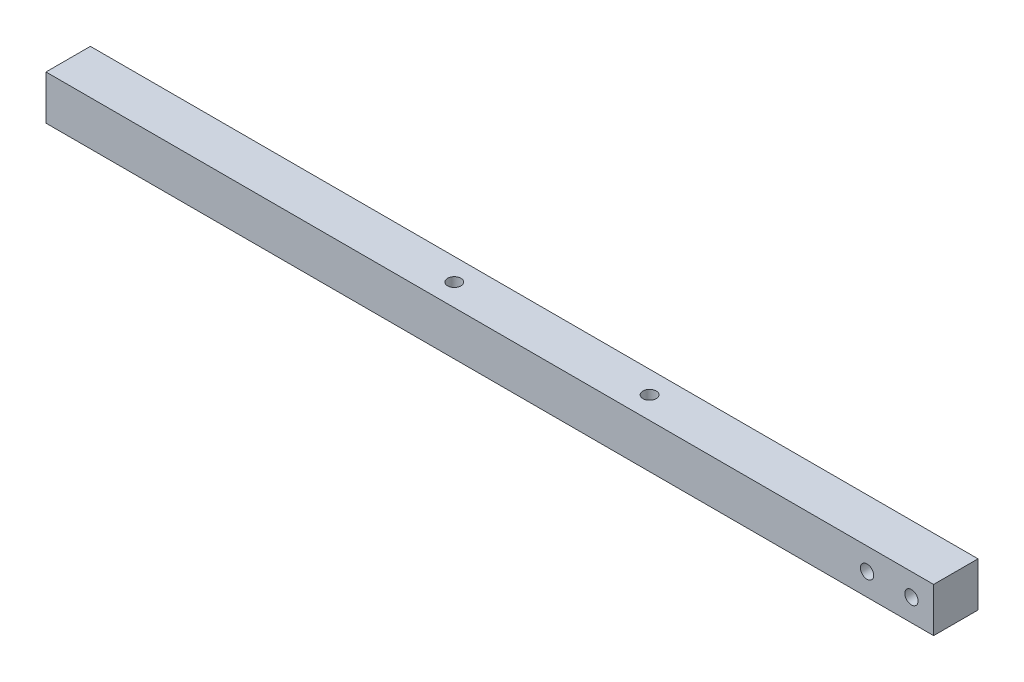
ISO-10303-21;
HEADER;
FILE_DESCRIPTION(('STEP AP214'),'2;1');
FILE_NAME('part.step','',(''),(''),'','','');
FILE_SCHEMA(('AUTOMOTIVE_DESIGN { 1 0 10303 214 1 1 1 1 }'));
ENDSEC;
DATA;
#1=APPLICATION_CONTEXT('core data for automotive mechanical design processes');
#2=APPLICATION_PROTOCOL_DEFINITION('international standard','automotive_design',2000,#1);
#3=PRODUCT_CONTEXT('',#1,'mechanical');
#4=PRODUCT('Part','Part','',(#3));
#5=PRODUCT_RELATED_PRODUCT_CATEGORY('part','',(#4));
#6=PRODUCT_DEFINITION_FORMATION('','',#4);
#7=PRODUCT_DEFINITION_CONTEXT('part definition',#1,'design');
#8=PRODUCT_DEFINITION('design','',#6,#7);
#9=PRODUCT_DEFINITION_SHAPE('','',#8);
#10=(LENGTH_UNIT() NAMED_UNIT(*) SI_UNIT(.MILLI.,.METRE.));
#11=(NAMED_UNIT(*) PLANE_ANGLE_UNIT() SI_UNIT($,.RADIAN.));
#12=(NAMED_UNIT(*) SI_UNIT($,.STERADIAN.) SOLID_ANGLE_UNIT());
#13=UNCERTAINTY_MEASURE_WITH_UNIT(LENGTH_MEASURE(1.E-05),#10,'distance_accuracy_value','');
#14=(GEOMETRIC_REPRESENTATION_CONTEXT(3) GLOBAL_UNCERTAINTY_ASSIGNED_CONTEXT((#13)) GLOBAL_UNIT_ASSIGNED_CONTEXT((#10,
#11,#12)) REPRESENTATION_CONTEXT('',''));
#15=CARTESIAN_POINT('',(0.,0.,0.));
#16=DIRECTION('',(0.,0.,1.));
#17=DIRECTION('',(1.,0.,0.));
#18=AXIS2_PLACEMENT_3D('',#15,#16,#17);
#19=CARTESIAN_POINT('',(400.,-10.,-10.));
#20=DIRECTION('',(0.,0.,1.));
#21=DIRECTION('',(1.,0.,0.));
#22=AXIS2_PLACEMENT_3D('',#19,#20,#21);
#23=PLANE('',#22);
#24=CARTESIAN_POINT('',(390.,0.,-10.));
#25=DIRECTION('',(0.,0.,1.));
#26=DIRECTION('',(1.,0.,0.));
#27=AXIS2_PLACEMENT_3D('',#24,#25,#26);
#28=CIRCLE('',#27,2.99999999999999);
#29=CARTESIAN_POINT('',(393.,0.,-10.));
#30=VERTEX_POINT('',#29);
#31=EDGE_CURVE('E114',#30,#30,#28,.T.);
#32=ORIENTED_EDGE('',*,*,#31,.T.);
#33=EDGE_LOOP('',(#32));
#34=FACE_BOUND('',#33,.T.);
#35=CARTESIAN_POINT('',(370.,0.,-10.));
#36=DIRECTION('',(0.,0.,1.));
#37=DIRECTION('',(1.,0.,0.));
#38=AXIS2_PLACEMENT_3D('',#35,#36,#37);
#39=CIRCLE('',#38,2.99999999999999);
#40=CARTESIAN_POINT('',(373.,0.,-10.));
#41=VERTEX_POINT('',#40);
#42=EDGE_CURVE('E125',#41,#41,#39,.T.);
#43=ORIENTED_EDGE('',*,*,#42,.T.);
#44=EDGE_LOOP('',(#43));
#45=FACE_BOUND('',#44,.T.);
#46=DIRECTION('',(0.,1.,0.));
#47=VECTOR('',#46,1.);
#48=CARTESIAN_POINT('',(0.,-10.,-10.));
#49=LINE('',#48,#47);
#50=CARTESIAN_POINT('',(0.,-10.,-10.));
#51=VERTEX_POINT('',#50);
#52=CARTESIAN_POINT('',(0.,10.,-10.));
#53=VERTEX_POINT('',#52);
#54=EDGE_CURVE('E96',#51,#53,#49,.T.);
#55=ORIENTED_EDGE('',*,*,#54,.T.);
#56=DIRECTION('',(-1.,0.,0.));
#57=VECTOR('',#56,1.);
#58=CARTESIAN_POINT('',(400.,10.,-10.));
#59=LINE('',#58,#57);
#60=CARTESIAN_POINT('',(400.,10.,-10.));
#61=VERTEX_POINT('',#60);
#62=EDGE_CURVE('E11',#61,#53,#59,.T.);
#63=ORIENTED_EDGE('',*,*,#62,.F.);
#64=DIRECTION('',(0.,1.,0.));
#65=VECTOR('',#64,1.);
#66=CARTESIAN_POINT('',(400.,-10.,-10.));
#67=LINE('',#66,#65);
#68=CARTESIAN_POINT('',(400.,-10.,-10.));
#69=VERTEX_POINT('',#68);
#70=EDGE_CURVE('E84',#69,#61,#67,.T.);
#71=ORIENTED_EDGE('',*,*,#70,.F.);
#72=DIRECTION('',(-1.,0.,0.));
#73=VECTOR('',#72,1.);
#74=CARTESIAN_POINT('',(400.,-10.,-10.));
#75=LINE('',#74,#73);
#76=EDGE_CURVE('E92',#69,#51,#75,.T.);
#77=ORIENTED_EDGE('',*,*,#76,.T.);
#78=EDGE_LOOP('',(#55,#63,#71,#77));
#79=FACE_BOUND('',#78,.T.);
#80=ADVANCED_FACE('F33',(#34,#45,#79),#23,.F.);
#81=CARTESIAN_POINT('',(400.,10.,10.));
#82=DIRECTION('',(0.,-1.,0.));
#83=DIRECTION('',(0.,0.,-1.));
#84=AXIS2_PLACEMENT_3D('',#81,#82,#83);
#85=PLANE('',#84);
#86=CARTESIAN_POINT('',(174.,10.,0.));
#87=DIRECTION('',(0.,1.,0.));
#88=DIRECTION('',(0.,0.,1.));
#89=AXIS2_PLACEMENT_3D('',#86,#87,#88);
#90=CIRCLE('',#89,2.99999999999999);
#91=CARTESIAN_POINT('',(174.,10.,2.99999999999999));
#92=VERTEX_POINT('',#91);
#93=EDGE_CURVE('E117',#92,#92,#90,.T.);
#94=ORIENTED_EDGE('',*,*,#93,.F.);
#95=EDGE_LOOP('',(#94));
#96=FACE_BOUND('',#95,.T.);
#97=CARTESIAN_POINT('',(262.,10.,0.));
#98=DIRECTION('',(0.,1.,0.));
#99=DIRECTION('',(0.,0.,1.));
#100=AXIS2_PLACEMENT_3D('',#97,#98,#99);
#101=CIRCLE('',#100,2.99999999999999);
#102=CARTESIAN_POINT('',(262.,10.,2.99999999999999));
#103=VERTEX_POINT('',#102);
#104=EDGE_CURVE('E110',#103,#103,#101,.T.);
#105=ORIENTED_EDGE('',*,*,#104,.F.);
#106=EDGE_LOOP('',(#105));
#107=FACE_BOUND('',#106,.T.);
#108=DIRECTION('',(0.,0.,1.));
#109=VECTOR('',#108,1.);
#110=CARTESIAN_POINT('',(0.,10.,10.));
#111=LINE('',#110,#109);
#112=CARTESIAN_POINT('',(0.,10.,10.));
#113=VERTEX_POINT('',#112);
#114=EDGE_CURVE('E88',#53,#113,#111,.T.);
#115=ORIENTED_EDGE('',*,*,#114,.T.);
#116=DIRECTION('',(-1.,0.,0.));
#117=VECTOR('',#116,1.);
#118=CARTESIAN_POINT('',(400.,10.,10.));
#119=LINE('',#118,#117);
#120=CARTESIAN_POINT('',(400.,10.,10.));
#121=VERTEX_POINT('',#120);
#122=EDGE_CURVE('E41',#121,#113,#119,.T.);
#123=ORIENTED_EDGE('',*,*,#122,.F.);
#124=DIRECTION('',(0.,0.,1.));
#125=VECTOR('',#124,1.);
#126=CARTESIAN_POINT('',(400.,10.,10.));
#127=LINE('',#126,#125);
#128=EDGE_CURVE('E79',#61,#121,#127,.T.);
#129=ORIENTED_EDGE('',*,*,#128,.F.);
#130=ORIENTED_EDGE('',*,*,#62,.T.);
#131=EDGE_LOOP('',(#115,#123,#129,#130));
#132=FACE_BOUND('',#131,.T.);
#133=ADVANCED_FACE('F87',(#96,#107,#132),#85,.F.);
#134=CARTESIAN_POINT('',(400.,-10.,10.));
#135=DIRECTION('',(0.,0.,-1.));
#136=DIRECTION('',(-1.,0.,0.));
#137=AXIS2_PLACEMENT_3D('',#134,#135,#136);
#138=PLANE('',#137);
#139=CARTESIAN_POINT('',(390.,0.,10.));
#140=DIRECTION('',(0.,0.,1.));
#141=DIRECTION('',(1.,0.,0.));
#142=AXIS2_PLACEMENT_3D('',#139,#140,#141);
#143=CIRCLE('',#142,2.99999999999999);
#144=CARTESIAN_POINT('',(393.,0.,10.));
#145=VERTEX_POINT('',#144);
#146=EDGE_CURVE('E128',#145,#145,#143,.T.);
#147=ORIENTED_EDGE('',*,*,#146,.F.);
#148=EDGE_LOOP('',(#147));
#149=FACE_BOUND('',#148,.T.);
#150=CARTESIAN_POINT('',(370.,0.,10.));
#151=DIRECTION('',(0.,0.,1.));
#152=DIRECTION('',(1.,0.,0.));
#153=AXIS2_PLACEMENT_3D('',#150,#151,#152);
#154=CIRCLE('',#153,2.99999999999999);
#155=CARTESIAN_POINT('',(373.,0.,10.));
#156=VERTEX_POINT('',#155);
#157=EDGE_CURVE('E122',#156,#156,#154,.T.);
#158=ORIENTED_EDGE('',*,*,#157,.F.);
#159=EDGE_LOOP('',(#158));
#160=FACE_BOUND('',#159,.T.);
#161=DIRECTION('',(0.,-1.,0.));
#162=VECTOR('',#161,1.);
#163=CARTESIAN_POINT('',(0.,-10.,10.));
#164=LINE('',#163,#162);
#165=CARTESIAN_POINT('',(0.,-10.,10.));
#166=VERTEX_POINT('',#165);
#167=EDGE_CURVE('E66',#113,#166,#164,.T.);
#168=ORIENTED_EDGE('',*,*,#167,.T.);
#169=DIRECTION('',(-1.,0.,0.));
#170=VECTOR('',#169,1.);
#171=CARTESIAN_POINT('',(400.,-10.,10.));
#172=LINE('',#171,#170);
#173=CARTESIAN_POINT('',(400.,-10.,10.));
#174=VERTEX_POINT('',#173);
#175=EDGE_CURVE('E89',#174,#166,#172,.T.);
#176=ORIENTED_EDGE('',*,*,#175,.F.);
#177=DIRECTION('',(0.,-1.,0.));
#178=VECTOR('',#177,1.);
#179=CARTESIAN_POINT('',(400.,-10.,10.));
#180=LINE('',#179,#178);
#181=EDGE_CURVE('E82',#121,#174,#180,.T.);
#182=ORIENTED_EDGE('',*,*,#181,.F.);
#183=ORIENTED_EDGE('',*,*,#122,.T.);
#184=EDGE_LOOP('',(#168,#176,#182,#183));
#185=FACE_BOUND('',#184,.T.);
#186=ADVANCED_FACE('F90',(#149,#160,#185),#138,.F.);
#187=CARTESIAN_POINT('',(400.,-10.,10.));
#188=DIRECTION('',(0.,1.,0.));
#189=DIRECTION('',(0.,0.,1.));
#190=AXIS2_PLACEMENT_3D('',#187,#188,#189);
#191=PLANE('',#190);
#192=CARTESIAN_POINT('',(174.,-10.,0.));
#193=DIRECTION('',(0.,1.,0.));
#194=DIRECTION('',(0.,0.,1.));
#195=AXIS2_PLACEMENT_3D('',#192,#193,#194);
#196=CIRCLE('',#195,2.99999999999999);
#197=CARTESIAN_POINT('',(174.,-10.,2.99999999999999));
#198=VERTEX_POINT('',#197);
#199=EDGE_CURVE('E99',#198,#198,#196,.T.);
#200=ORIENTED_EDGE('',*,*,#199,.T.);
#201=EDGE_LOOP('',(#200));
#202=FACE_BOUND('',#201,.T.);
#203=CARTESIAN_POINT('',(262.,-10.,0.));
#204=DIRECTION('',(0.,1.,0.));
#205=DIRECTION('',(0.,0.,1.));
#206=AXIS2_PLACEMENT_3D('',#203,#204,#205);
#207=CIRCLE('',#206,2.99999999999999);
#208=CARTESIAN_POINT('',(262.,-10.,2.99999999999999));
#209=VERTEX_POINT('',#208);
#210=EDGE_CURVE('E113',#209,#209,#207,.T.);
#211=ORIENTED_EDGE('',*,*,#210,.T.);
#212=EDGE_LOOP('',(#211));
#213=FACE_BOUND('',#212,.T.);
#214=DIRECTION('',(0.,0.,-1.));
#215=VECTOR('',#214,1.);
#216=CARTESIAN_POINT('',(0.,-10.,10.));
#217=LINE('',#216,#215);
#218=EDGE_CURVE('E72',#166,#51,#217,.T.);
#219=ORIENTED_EDGE('',*,*,#218,.T.);
#220=ORIENTED_EDGE('',*,*,#76,.F.);
#221=DIRECTION('',(0.,0.,-1.));
#222=VECTOR('',#221,1.);
#223=CARTESIAN_POINT('',(400.,-10.,10.));
#224=LINE('',#223,#222);
#225=EDGE_CURVE('E49',#174,#69,#224,.T.);
#226=ORIENTED_EDGE('',*,*,#225,.F.);
#227=ORIENTED_EDGE('',*,*,#175,.T.);
#228=EDGE_LOOP('',(#219,#220,#226,#227));
#229=FACE_BOUND('',#228,.T.);
#230=ADVANCED_FACE('F104',(#202,#213,#229),#191,.F.);
#231=CARTESIAN_POINT('',(400.,0.,0.));
#232=DIRECTION('',(-1.,0.,0.));
#233=DIRECTION('',(0.,0.,1.));
#234=AXIS2_PLACEMENT_3D('',#231,#232,#233);
#235=PLANE('',#234);
#236=ORIENTED_EDGE('',*,*,#70,.T.);
#237=ORIENTED_EDGE('',*,*,#128,.T.);
#238=ORIENTED_EDGE('',*,*,#181,.T.);
#239=ORIENTED_EDGE('',*,*,#225,.T.);
#240=EDGE_LOOP('',(#236,#237,#238,#239));
#241=FACE_BOUND('',#240,.T.);
#242=ADVANCED_FACE('F80',(#241),#235,.F.);
#243=CARTESIAN_POINT('',(0.,0.,0.));
#244=DIRECTION('',(-1.,0.,0.));
#245=DIRECTION('',(0.,0.,1.));
#246=AXIS2_PLACEMENT_3D('',#243,#244,#245);
#247=PLANE('',#246);
#248=ORIENTED_EDGE('',*,*,#54,.F.);
#249=ORIENTED_EDGE('',*,*,#218,.F.);
#250=ORIENTED_EDGE('',*,*,#167,.F.);
#251=ORIENTED_EDGE('',*,*,#114,.F.);
#252=EDGE_LOOP('',(#248,#249,#250,#251));
#253=FACE_BOUND('',#252,.T.);
#254=ADVANCED_FACE('F107',(#253),#247,.T.);
#255=CARTESIAN_POINT('',(262.,-10.,0.));
#256=DIRECTION('',(0.,1.,0.));
#257=DIRECTION('',(0.,0.,1.));
#258=AXIS2_PLACEMENT_3D('',#255,#256,#257);
#259=CYLINDRICAL_SURFACE('',#258,2.99999999999999);
#260=ORIENTED_EDGE('',*,*,#210,.F.);
#261=EDGE_LOOP('',(#260));
#262=FACE_BOUND('',#261,.T.);
#263=ORIENTED_EDGE('',*,*,#104,.T.);
#264=EDGE_LOOP('',(#263));
#265=FACE_BOUND('',#264,.T.);
#266=ADVANCED_FACE('F155',(#262,#265),#259,.F.);
#267=CARTESIAN_POINT('',(174.,-10.,0.));
#268=DIRECTION('',(0.,1.,0.));
#269=DIRECTION('',(0.,0.,1.));
#270=AXIS2_PLACEMENT_3D('',#267,#268,#269);
#271=CYLINDRICAL_SURFACE('',#270,2.99999999999999);
#272=ORIENTED_EDGE('',*,*,#199,.F.);
#273=EDGE_LOOP('',(#272));
#274=FACE_BOUND('',#273,.T.);
#275=ORIENTED_EDGE('',*,*,#93,.T.);
#276=EDGE_LOOP('',(#275));
#277=FACE_BOUND('',#276,.T.);
#278=ADVANCED_FACE('F149',(#274,#277),#271,.F.);
#279=CARTESIAN_POINT('',(370.,0.,-10.));
#280=DIRECTION('',(0.,0.,1.));
#281=DIRECTION('',(1.,0.,0.));
#282=AXIS2_PLACEMENT_3D('',#279,#280,#281);
#283=CYLINDRICAL_SURFACE('',#282,2.99999999999999);
#284=ORIENTED_EDGE('',*,*,#42,.F.);
#285=EDGE_LOOP('',(#284));
#286=FACE_BOUND('',#285,.T.);
#287=ORIENTED_EDGE('',*,*,#157,.T.);
#288=EDGE_LOOP('',(#287));
#289=FACE_BOUND('',#288,.T.);
#290=ADVANCED_FACE('F139',(#286,#289),#283,.F.);
#291=CARTESIAN_POINT('',(390.,0.,-10.));
#292=DIRECTION('',(0.,0.,1.));
#293=DIRECTION('',(1.,0.,0.));
#294=AXIS2_PLACEMENT_3D('',#291,#292,#293);
#295=CYLINDRICAL_SURFACE('',#294,2.99999999999999);
#296=ORIENTED_EDGE('',*,*,#31,.F.);
#297=EDGE_LOOP('',(#296));
#298=FACE_BOUND('',#297,.T.);
#299=ORIENTED_EDGE('',*,*,#146,.T.);
#300=EDGE_LOOP('',(#299));
#301=FACE_BOUND('',#300,.T.);
#302=ADVANCED_FACE('F136',(#298,#301),#295,.F.);
#303=CLOSED_SHELL('',(#80,#133,#186,#230,#242,#254,#266,#278,#290,#302));
#304=MANIFOLD_SOLID_BREP('B2',#303);
#305=ADVANCED_BREP_SHAPE_REPRESENTATION('',(#18,#304),#14);
#306=SHAPE_DEFINITION_REPRESENTATION(#9,#305);
ENDSEC;
END-ISO-10303-21;
